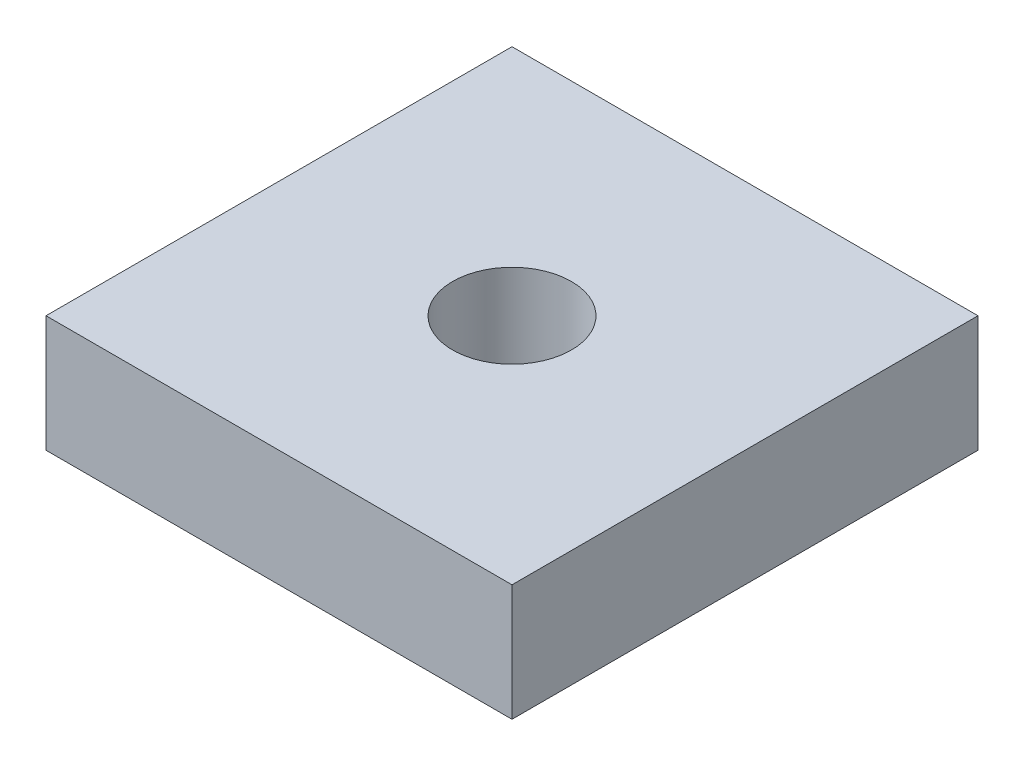
ISO-10303-21;
HEADER;
FILE_DESCRIPTION(('STEP AP214'),'2;1');
FILE_NAME('part.step','',(''),(''),'','','');
FILE_SCHEMA(('AUTOMOTIVE_DESIGN { 1 0 10303 214 1 1 1 1 }'));
ENDSEC;
DATA;
#1=APPLICATION_CONTEXT('core data for automotive mechanical design processes');
#2=APPLICATION_PROTOCOL_DEFINITION('international standard','automotive_design',2000,#1);
#3=PRODUCT_CONTEXT('',#1,'mechanical');
#4=PRODUCT('Part','Part','',(#3));
#5=PRODUCT_RELATED_PRODUCT_CATEGORY('part','',(#4));
#6=PRODUCT_DEFINITION_FORMATION('','',#4);
#7=PRODUCT_DEFINITION_CONTEXT('part definition',#1,'design');
#8=PRODUCT_DEFINITION('design','',#6,#7);
#9=PRODUCT_DEFINITION_SHAPE('','',#8);
#10=(LENGTH_UNIT() NAMED_UNIT(*) SI_UNIT(.MILLI.,.METRE.));
#11=(NAMED_UNIT(*) PLANE_ANGLE_UNIT() SI_UNIT($,.RADIAN.));
#12=(NAMED_UNIT(*) SI_UNIT($,.STERADIAN.) SOLID_ANGLE_UNIT());
#13=UNCERTAINTY_MEASURE_WITH_UNIT(LENGTH_MEASURE(1.E-05),#10,'distance_accuracy_value','');
#14=(GEOMETRIC_REPRESENTATION_CONTEXT(3) GLOBAL_UNCERTAINTY_ASSIGNED_CONTEXT((#13)) GLOBAL_UNIT_ASSIGNED_CONTEXT((#10,
#11,#12)) REPRESENTATION_CONTEXT('',''));
#15=CARTESIAN_POINT('',(0.,0.,0.));
#16=DIRECTION('',(0.,0.,1.));
#17=DIRECTION('',(1.,0.,0.));
#18=AXIS2_PLACEMENT_3D('',#15,#16,#17);
#19=CARTESIAN_POINT('',(0.,488.,0.));
#20=DIRECTION('',(0.,-1.,0.));
#21=DIRECTION('',(0.,0.,-1.));
#22=AXIS2_PLACEMENT_3D('',#19,#20,#21);
#23=PLANE('',#22);
#24=DIRECTION('',(0.,0.,1.));
#25=VECTOR('',#24,1.);
#26=CARTESIAN_POINT('',(695.,488.,370.));
#27=LINE('',#26,#25);
#28=CARTESIAN_POINT('',(695.,488.,330.));
#29=VERTEX_POINT('',#28);
#30=CARTESIAN_POINT('',(695.,488.,370.));
#31=VERTEX_POINT('',#30);
#32=EDGE_CURVE('E92',#29,#31,#27,.T.);
#33=ORIENTED_EDGE('',*,*,#32,.T.);
#34=DIRECTION('',(-1.,0.,0.));
#35=VECTOR('',#34,1.);
#36=CARTESIAN_POINT('',(655.,488.,370.));
#37=LINE('',#36,#35);
#38=CARTESIAN_POINT('',(655.,488.,370.));
#39=VERTEX_POINT('',#38);
#40=EDGE_CURVE('E87',#31,#39,#37,.T.);
#41=ORIENTED_EDGE('',*,*,#40,.T.);
#42=DIRECTION('',(0.,0.,-1.));
#43=VECTOR('',#42,1.);
#44=CARTESIAN_POINT('',(655.,488.,370.));
#45=LINE('',#44,#43);
#46=CARTESIAN_POINT('',(655.,488.,330.));
#47=VERTEX_POINT('',#46);
#48=EDGE_CURVE('E90',#39,#47,#45,.T.);
#49=ORIENTED_EDGE('',*,*,#48,.T.);
#50=DIRECTION('',(1.,0.,0.));
#51=VECTOR('',#50,1.);
#52=CARTESIAN_POINT('',(655.,488.,330.));
#53=LINE('',#52,#51);
#54=EDGE_CURVE('E57',#47,#29,#53,.T.);
#55=ORIENTED_EDGE('',*,*,#54,.T.);
#56=EDGE_LOOP('',(#33,#41,#49,#55));
#57=FACE_BOUND('',#56,.T.);
#58=CARTESIAN_POINT('',(675.,488.,350.));
#59=DIRECTION('',(0.,-1.,0.));
#60=DIRECTION('',(0.,0.,-1.));
#61=AXIS2_PLACEMENT_3D('',#58,#59,#60);
#62=CIRCLE('',#61,5.09999999999998);
#63=CARTESIAN_POINT('',(675.,488.,344.9));
#64=VERTEX_POINT('',#63);
#65=EDGE_CURVE('E107',#64,#64,#62,.T.);
#66=ORIENTED_EDGE('',*,*,#65,.F.);
#67=EDGE_LOOP('',(#66));
#68=FACE_BOUND('',#67,.T.);
#69=ADVANCED_FACE('F40',(#57,#68),#23,.T.);
#70=CARTESIAN_POINT('',(0.,498.,0.));
#71=DIRECTION('',(0.,-1.,0.));
#72=DIRECTION('',(0.,0.,-1.));
#73=AXIS2_PLACEMENT_3D('',#70,#71,#72);
#74=PLANE('',#73);
#75=DIRECTION('',(0.,0.,1.));
#76=VECTOR('',#75,1.);
#77=CARTESIAN_POINT('',(695.,498.,370.));
#78=LINE('',#77,#76);
#79=CARTESIAN_POINT('',(695.,498.,330.));
#80=VERTEX_POINT('',#79);
#81=CARTESIAN_POINT('',(695.,498.,370.));
#82=VERTEX_POINT('',#81);
#83=EDGE_CURVE('E104',#80,#82,#78,.T.);
#84=ORIENTED_EDGE('',*,*,#83,.F.);
#85=DIRECTION('',(1.,0.,0.));
#86=VECTOR('',#85,1.);
#87=CARTESIAN_POINT('',(655.,498.,330.));
#88=LINE('',#87,#86);
#89=CARTESIAN_POINT('',(655.,498.,330.));
#90=VERTEX_POINT('',#89);
#91=EDGE_CURVE('E80',#90,#80,#88,.T.);
#92=ORIENTED_EDGE('',*,*,#91,.F.);
#93=DIRECTION('',(0.,0.,-1.));
#94=VECTOR('',#93,1.);
#95=CARTESIAN_POINT('',(655.,498.,370.));
#96=LINE('',#95,#94);
#97=CARTESIAN_POINT('',(655.,498.,370.));
#98=VERTEX_POINT('',#97);
#99=EDGE_CURVE('E74',#98,#90,#96,.T.);
#100=ORIENTED_EDGE('',*,*,#99,.F.);
#101=DIRECTION('',(-1.,0.,0.));
#102=VECTOR('',#101,1.);
#103=CARTESIAN_POINT('',(655.,498.,370.));
#104=LINE('',#103,#102);
#105=EDGE_CURVE('E96',#82,#98,#104,.T.);
#106=ORIENTED_EDGE('',*,*,#105,.F.);
#107=EDGE_LOOP('',(#84,#92,#100,#106));
#108=FACE_BOUND('',#107,.T.);
#109=CARTESIAN_POINT('',(675.,498.,350.));
#110=DIRECTION('',(0.,-1.,0.));
#111=DIRECTION('',(0.,0.,-1.));
#112=AXIS2_PLACEMENT_3D('',#109,#110,#111);
#113=CIRCLE('',#112,5.09999999999998);
#114=CARTESIAN_POINT('',(675.,498.,344.9));
#115=VERTEX_POINT('',#114);
#116=EDGE_CURVE('E119',#115,#115,#113,.T.);
#117=ORIENTED_EDGE('',*,*,#116,.T.);
#118=EDGE_LOOP('',(#117));
#119=FACE_BOUND('',#118,.T.);
#120=ADVANCED_FACE('F115',(#108,#119),#74,.F.);
#121=CARTESIAN_POINT('',(695.,488.,370.));
#122=DIRECTION('',(-1.,0.,0.));
#123=DIRECTION('',(0.,0.,1.));
#124=AXIS2_PLACEMENT_3D('',#121,#122,#123);
#125=PLANE('',#124);
#126=ORIENTED_EDGE('',*,*,#83,.T.);
#127=DIRECTION('',(0.,1.,0.));
#128=VECTOR('',#127,1.);
#129=CARTESIAN_POINT('',(695.,488.,370.));
#130=LINE('',#129,#128);
#131=EDGE_CURVE('E11',#31,#82,#130,.T.);
#132=ORIENTED_EDGE('',*,*,#131,.F.);
#133=ORIENTED_EDGE('',*,*,#32,.F.);
#134=DIRECTION('',(0.,1.,0.));
#135=VECTOR('',#134,1.);
#136=CARTESIAN_POINT('',(695.,488.,330.));
#137=LINE('',#136,#135);
#138=EDGE_CURVE('E100',#29,#80,#137,.T.);
#139=ORIENTED_EDGE('',*,*,#138,.T.);
#140=EDGE_LOOP('',(#126,#132,#133,#139));
#141=FACE_BOUND('',#140,.T.);
#142=ADVANCED_FACE('F42',(#141),#125,.F.);
#143=CARTESIAN_POINT('',(655.,488.,370.));
#144=DIRECTION('',(0.,0.,-1.));
#145=DIRECTION('',(-1.,0.,0.));
#146=AXIS2_PLACEMENT_3D('',#143,#144,#145);
#147=PLANE('',#146);
#148=ORIENTED_EDGE('',*,*,#105,.T.);
#149=DIRECTION('',(0.,1.,0.));
#150=VECTOR('',#149,1.);
#151=CARTESIAN_POINT('',(655.,488.,370.));
#152=LINE('',#151,#150);
#153=EDGE_CURVE('E49',#39,#98,#152,.T.);
#154=ORIENTED_EDGE('',*,*,#153,.F.);
#155=ORIENTED_EDGE('',*,*,#40,.F.);
#156=ORIENTED_EDGE('',*,*,#131,.T.);
#157=EDGE_LOOP('',(#148,#154,#155,#156));
#158=FACE_BOUND('',#157,.T.);
#159=ADVANCED_FACE('F95',(#158),#147,.F.);
#160=CARTESIAN_POINT('',(655.,488.,370.));
#161=DIRECTION('',(1.,0.,0.));
#162=DIRECTION('',(0.,0.,-1.));
#163=AXIS2_PLACEMENT_3D('',#160,#161,#162);
#164=PLANE('',#163);
#165=ORIENTED_EDGE('',*,*,#99,.T.);
#166=DIRECTION('',(0.,1.,0.));
#167=VECTOR('',#166,1.);
#168=CARTESIAN_POINT('',(655.,488.,330.));
#169=LINE('',#168,#167);
#170=EDGE_CURVE('E97',#47,#90,#169,.T.);
#171=ORIENTED_EDGE('',*,*,#170,.F.);
#172=ORIENTED_EDGE('',*,*,#48,.F.);
#173=ORIENTED_EDGE('',*,*,#153,.T.);
#174=EDGE_LOOP('',(#165,#171,#172,#173));
#175=FACE_BOUND('',#174,.T.);
#176=ADVANCED_FACE('F98',(#175),#164,.F.);
#177=CARTESIAN_POINT('',(655.,488.,330.));
#178=DIRECTION('',(0.,0.,1.));
#179=DIRECTION('',(1.,0.,0.));
#180=AXIS2_PLACEMENT_3D('',#177,#178,#179);
#181=PLANE('',#180);
#182=ORIENTED_EDGE('',*,*,#91,.T.);
#183=ORIENTED_EDGE('',*,*,#138,.F.);
#184=ORIENTED_EDGE('',*,*,#54,.F.);
#185=ORIENTED_EDGE('',*,*,#170,.T.);
#186=EDGE_LOOP('',(#182,#183,#184,#185));
#187=FACE_BOUND('',#186,.T.);
#188=ADVANCED_FACE('F112',(#187),#181,.F.);
#189=CARTESIAN_POINT('',(675.,488.,350.));
#190=DIRECTION('',(0.,1.,0.));
#191=DIRECTION('',(0.,0.,1.));
#192=AXIS2_PLACEMENT_3D('',#189,#190,#191);
#193=CYLINDRICAL_SURFACE('',#192,5.09999999999998);
#194=ORIENTED_EDGE('',*,*,#65,.T.);
#195=EDGE_LOOP('',(#194));
#196=FACE_BOUND('',#195,.T.);
#197=ORIENTED_EDGE('',*,*,#116,.F.);
#198=EDGE_LOOP('',(#197));
#199=FACE_BOUND('',#198,.T.);
#200=ADVANCED_FACE('F125',(#196,#199),#193,.F.);
#201=CLOSED_SHELL('',(#69,#120,#142,#159,#176,#188,#200));
#202=MANIFOLD_SOLID_BREP('B2',#201);
#203=ADVANCED_BREP_SHAPE_REPRESENTATION('',(#18,#202),#14);
#204=SHAPE_DEFINITION_REPRESENTATION(#9,#203);
ENDSEC;
END-ISO-10303-21;
